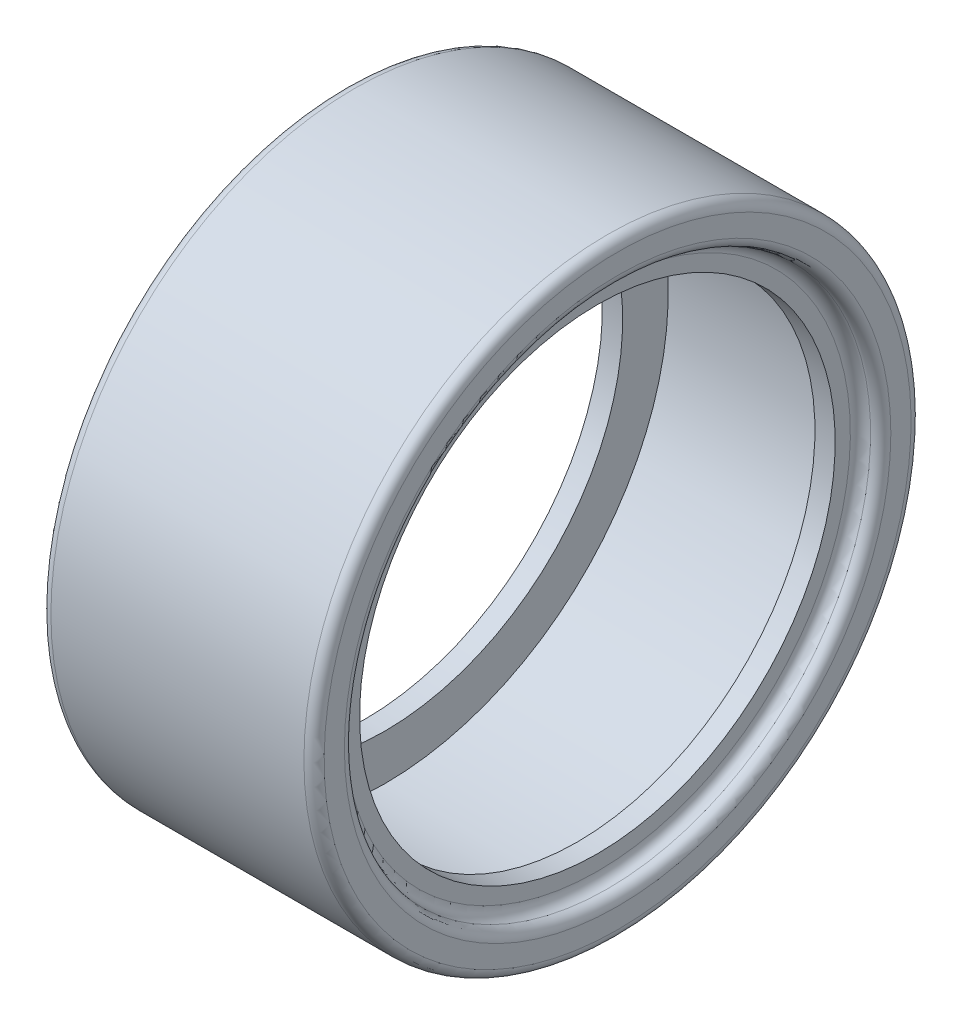
ISO-10303-21;
HEADER;
FILE_DESCRIPTION(('STEP AP214'),'2;1');
FILE_NAME('part.step','',(''),(''),'','','');
FILE_SCHEMA(('AUTOMOTIVE_DESIGN { 1 0 10303 214 1 1 1 1 }'));
ENDSEC;
DATA;
#1=APPLICATION_CONTEXT('core data for automotive mechanical design processes');
#2=APPLICATION_PROTOCOL_DEFINITION('international standard','automotive_design',2000,#1);
#3=PRODUCT_CONTEXT('',#1,'mechanical');
#4=PRODUCT('Part','Part','',(#3));
#5=PRODUCT_RELATED_PRODUCT_CATEGORY('part','',(#4));
#6=PRODUCT_DEFINITION_FORMATION('','',#4);
#7=PRODUCT_DEFINITION_CONTEXT('part definition',#1,'design');
#8=PRODUCT_DEFINITION('design','',#6,#7);
#9=PRODUCT_DEFINITION_SHAPE('','',#8);
#10=(LENGTH_UNIT() NAMED_UNIT(*) SI_UNIT(.MILLI.,.METRE.));
#11=(NAMED_UNIT(*) PLANE_ANGLE_UNIT() SI_UNIT($,.RADIAN.));
#12=(NAMED_UNIT(*) SI_UNIT($,.STERADIAN.) SOLID_ANGLE_UNIT());
#13=UNCERTAINTY_MEASURE_WITH_UNIT(LENGTH_MEASURE(1.E-05),#10,'distance_accuracy_value','');
#14=(GEOMETRIC_REPRESENTATION_CONTEXT(3) GLOBAL_UNCERTAINTY_ASSIGNED_CONTEXT((#13)) GLOBAL_UNIT_ASSIGNED_CONTEXT((#10,
#11,#12)) REPRESENTATION_CONTEXT('',''));
#15=CARTESIAN_POINT('',(0.,0.,0.));
#16=DIRECTION('',(0.,0.,1.));
#17=DIRECTION('',(1.,0.,0.));
#18=AXIS2_PLACEMENT_3D('',#15,#16,#17);
#19=CARTESIAN_POINT('',(-11.5,0.,0.));
#20=DIRECTION('',(-1.,0.,0.));
#21=DIRECTION('',(0.,-1.,0.));
#22=AXIS2_PLACEMENT_3D('',#19,#20,#21);
#23=CYLINDRICAL_SURFACE('',#22,23.5);
#24=CARTESIAN_POINT('',(-11.5,0.,0.));
#25=DIRECTION('',(-1.,0.,0.));
#26=DIRECTION('',(0.,-1.,0.));
#27=AXIS2_PLACEMENT_3D('',#24,#25,#26);
#28=CIRCLE('',#27,23.5);
#29=CARTESIAN_POINT('',(-11.5,-23.5,0.));
#30=VERTEX_POINT('',#29);
#31=EDGE_CURVE('E196',#30,#30,#28,.T.);
#32=ORIENTED_EDGE('',*,*,#31,.T.);
#33=EDGE_LOOP('',(#32));
#34=FACE_BOUND('',#33,.T.);
#35=CARTESIAN_POINT('',(-9.49999999999999,0.,0.));
#36=DIRECTION('',(1.,0.,0.));
#37=DIRECTION('',(0.,1.,0.));
#38=AXIS2_PLACEMENT_3D('',#35,#36,#37);
#39=CIRCLE('',#38,23.5);
#40=CARTESIAN_POINT('',(-9.5,23.5,0.));
#41=VERTEX_POINT('',#40);
#42=EDGE_CURVE('E179',#41,#41,#39,.F.);
#43=ORIENTED_EDGE('',*,*,#42,.F.);
#44=EDGE_LOOP('',(#43));
#45=FACE_BOUND('',#44,.T.);
#46=ADVANCED_FACE('F41',(#34,#45),#23,.F.);
#47=CARTESIAN_POINT('',(9.5,0.,0.));
#48=DIRECTION('',(-1.,0.,0.));
#49=DIRECTION('',(0.,-1.,0.));
#50=AXIS2_PLACEMENT_3D('',#47,#48,#49);
#51=CIRCLE('',#50,23.5);
#52=CARTESIAN_POINT('',(9.50000000000001,-23.5,0.));
#53=VERTEX_POINT('',#52);
#54=EDGE_CURVE('E62',#53,#53,#51,.T.);
#55=ORIENTED_EDGE('',*,*,#54,.T.);
#56=EDGE_LOOP('',(#55));
#57=FACE_BOUND('',#56,.T.);
#58=CARTESIAN_POINT('',(11.5,0.,0.));
#59=DIRECTION('',(-1.,0.,0.));
#60=DIRECTION('',(0.,-1.,0.));
#61=AXIS2_PLACEMENT_3D('',#58,#59,#60);
#62=CIRCLE('',#61,23.5);
#63=CARTESIAN_POINT('',(11.5,-23.5,0.));
#64=VERTEX_POINT('',#63);
#65=EDGE_CURVE('E188',#64,#64,#62,.T.);
#66=ORIENTED_EDGE('',*,*,#65,.F.);
#67=EDGE_LOOP('',(#66));
#68=FACE_BOUND('',#67,.T.);
#69=ADVANCED_FACE('F92',(#57,#68),#23,.F.);
#70=CARTESIAN_POINT('',(-11.5,23.5,0.));
#71=DIRECTION('',(1.,0.,0.));
#72=DIRECTION('',(0.,1.,0.));
#73=AXIS2_PLACEMENT_3D('',#70,#71,#72);
#74=PLANE('',#73);
#75=CARTESIAN_POINT('',(-11.5,0.,0.));
#76=DIRECTION('',(1.,0.,0.));
#77=DIRECTION('',(0.,1.,0.));
#78=AXIS2_PLACEMENT_3D('',#75,#76,#77);
#79=CIRCLE('',#78,25.);
#80=CARTESIAN_POINT('',(-11.5,25.,0.));
#81=VERTEX_POINT('',#80);
#82=EDGE_CURVE('E120',#81,#81,#79,.F.);
#83=ORIENTED_EDGE('',*,*,#82,.T.);
#84=EDGE_LOOP('',(#83));
#85=FACE_BOUND('',#84,.T.);
#86=ORIENTED_EDGE('',*,*,#31,.F.);
#87=EDGE_LOOP('',(#86));
#88=FACE_BOUND('',#87,.T.);
#89=ADVANCED_FACE('F98',(#85,#88),#74,.F.);
#90=CARTESIAN_POINT('',(-13.5,26.,0.));
#91=DIRECTION('',(1.,0.,0.));
#92=DIRECTION('',(0.,1.,0.));
#93=AXIS2_PLACEMENT_3D('',#90,#91,#92);
#94=PLANE('',#93);
#95=CARTESIAN_POINT('',(-13.5,0.,0.));
#96=DIRECTION('',(1.,0.,0.));
#97=DIRECTION('',(0.,1.,0.));
#98=AXIS2_PLACEMENT_3D('',#95,#96,#97);
#99=CIRCLE('',#98,27.);
#100=CARTESIAN_POINT('',(-13.5,27.,0.));
#101=VERTEX_POINT('',#100);
#102=EDGE_CURVE('E56',#101,#101,#99,.T.);
#103=ORIENTED_EDGE('',*,*,#102,.T.);
#104=EDGE_LOOP('',(#103));
#105=FACE_BOUND('',#104,.T.);
#106=CARTESIAN_POINT('',(-13.5,0.,0.));
#107=DIRECTION('',(1.,0.,0.));
#108=DIRECTION('',(0.,1.,0.));
#109=AXIS2_PLACEMENT_3D('',#106,#107,#108);
#110=CIRCLE('',#109,29.);
#111=CARTESIAN_POINT('',(-13.5,29.,0.));
#112=VERTEX_POINT('',#111);
#113=EDGE_CURVE('E126',#112,#112,#110,.F.);
#114=ORIENTED_EDGE('',*,*,#113,.T.);
#115=EDGE_LOOP('',(#114));
#116=FACE_BOUND('',#115,.T.);
#117=ADVANCED_FACE('F138',(#105,#116),#94,.F.);
#118=CARTESIAN_POINT('',(-11.5,0.,0.));
#119=DIRECTION('',(-1.,0.,0.));
#120=DIRECTION('',(0.,-1.,0.));
#121=AXIS2_PLACEMENT_3D('',#118,#119,#120);
#122=CYLINDRICAL_SURFACE('',#121,30.);
#123=CARTESIAN_POINT('',(-12.5,0.,0.));
#124=DIRECTION('',(1.,0.,0.));
#125=DIRECTION('',(0.,1.,0.));
#126=AXIS2_PLACEMENT_3D('',#123,#124,#125);
#127=CIRCLE('',#126,30.);
#128=CARTESIAN_POINT('',(-12.5,30.,0.));
#129=VERTEX_POINT('',#128);
#130=EDGE_CURVE('E10',#129,#129,#127,.T.);
#131=ORIENTED_EDGE('',*,*,#130,.T.);
#132=EDGE_LOOP('',(#131));
#133=FACE_BOUND('',#132,.T.);
#134=CARTESIAN_POINT('',(12.5,0.,0.));
#135=DIRECTION('',(-1.,0.,0.));
#136=DIRECTION('',(0.,-1.,0.));
#137=AXIS2_PLACEMENT_3D('',#134,#135,#136);
#138=CIRCLE('',#137,30.);
#139=CARTESIAN_POINT('',(12.5,-30.,0.));
#140=VERTEX_POINT('',#139);
#141=EDGE_CURVE('E50',#140,#140,#138,.T.);
#142=ORIENTED_EDGE('',*,*,#141,.T.);
#143=EDGE_LOOP('',(#142));
#144=FACE_BOUND('',#143,.T.);
#145=ADVANCED_FACE('F141',(#133,#144),#122,.T.);
#146=CARTESIAN_POINT('',(13.5,30.,0.));
#147=DIRECTION('',(-1.,0.,0.));
#148=DIRECTION('',(0.,-1.,0.));
#149=AXIS2_PLACEMENT_3D('',#146,#147,#148);
#150=PLANE('',#149);
#151=CARTESIAN_POINT('',(13.5,0.,0.));
#152=DIRECTION('',(-1.,0.,0.));
#153=DIRECTION('',(0.,-1.,0.));
#154=AXIS2_PLACEMENT_3D('',#151,#152,#153);
#155=CIRCLE('',#154,27.);
#156=CARTESIAN_POINT('',(13.5,-27.,0.));
#157=VERTEX_POINT('',#156);
#158=EDGE_CURVE('E117',#157,#157,#155,.T.);
#159=ORIENTED_EDGE('',*,*,#158,.T.);
#160=EDGE_LOOP('',(#159));
#161=FACE_BOUND('',#160,.T.);
#162=CARTESIAN_POINT('',(13.5,0.,0.));
#163=DIRECTION('',(-1.,0.,0.));
#164=DIRECTION('',(0.,-1.,0.));
#165=AXIS2_PLACEMENT_3D('',#162,#163,#164);
#166=CIRCLE('',#165,29.);
#167=CARTESIAN_POINT('',(13.5,-29.,0.));
#168=VERTEX_POINT('',#167);
#169=EDGE_CURVE('E121',#168,#168,#166,.F.);
#170=ORIENTED_EDGE('',*,*,#169,.T.);
#171=EDGE_LOOP('',(#170));
#172=FACE_BOUND('',#171,.T.);
#173=ADVANCED_FACE('F157',(#161,#172),#150,.F.);
#174=CARTESIAN_POINT('',(11.5,26.,0.));
#175=DIRECTION('',(-1.,0.,0.));
#176=DIRECTION('',(0.,-1.,0.));
#177=AXIS2_PLACEMENT_3D('',#174,#175,#176);
#178=PLANE('',#177);
#179=CARTESIAN_POINT('',(11.5,0.,0.));
#180=DIRECTION('',(-1.,0.,0.));
#181=DIRECTION('',(0.,-1.,0.));
#182=AXIS2_PLACEMENT_3D('',#179,#180,#181);
#183=CIRCLE('',#182,25.);
#184=CARTESIAN_POINT('',(11.5,-25.,0.));
#185=VERTEX_POINT('',#184);
#186=EDGE_CURVE('E129',#185,#185,#183,.F.);
#187=ORIENTED_EDGE('',*,*,#186,.T.);
#188=EDGE_LOOP('',(#187));
#189=FACE_BOUND('',#188,.T.);
#190=ORIENTED_EDGE('',*,*,#65,.T.);
#191=EDGE_LOOP('',(#190));
#192=FACE_BOUND('',#191,.T.);
#193=ADVANCED_FACE('F162',(#189,#192),#178,.F.);
#194=CARTESIAN_POINT('',(-9.5,23.5,0.));
#195=DIRECTION('',(1.,0.,0.));
#196=DIRECTION('',(0.,1.,0.));
#197=AXIS2_PLACEMENT_3D('',#194,#195,#196);
#198=PLANE('',#197);
#199=ORIENTED_EDGE('',*,*,#42,.T.);
#200=EDGE_LOOP('',(#199));
#201=FACE_BOUND('',#200,.T.);
#202=CARTESIAN_POINT('',(-9.49999999999999,0.,0.));
#203=DIRECTION('',(1.,0.,0.));
#204=DIRECTION('',(0.,1.,0.));
#205=AXIS2_PLACEMENT_3D('',#202,#203,#204);
#206=CIRCLE('',#205,28.);
#207=CARTESIAN_POINT('',(-9.5,28.,0.));
#208=VERTEX_POINT('',#207);
#209=EDGE_CURVE('E182',#208,#208,#206,.F.);
#210=ORIENTED_EDGE('',*,*,#209,.F.);
#211=EDGE_LOOP('',(#210));
#212=FACE_BOUND('',#211,.T.);
#213=ADVANCED_FACE('F166',(#201,#212),#198,.T.);
#214=CARTESIAN_POINT('',(-11.5,0.,0.));
#215=DIRECTION('',(-1.,0.,0.));
#216=DIRECTION('',(0.,-1.,0.));
#217=AXIS2_PLACEMENT_3D('',#214,#215,#216);
#218=CYLINDRICAL_SURFACE('',#217,28.);
#219=CARTESIAN_POINT('',(9.5,0.,0.));
#220=DIRECTION('',(-1.,0.,0.));
#221=DIRECTION('',(0.,-1.,0.));
#222=AXIS2_PLACEMENT_3D('',#219,#220,#221);
#223=CIRCLE('',#222,28.);
#224=CARTESIAN_POINT('',(9.50000000000001,-28.,0.));
#225=VERTEX_POINT('',#224);
#226=EDGE_CURVE('E68',#225,#225,#223,.T.);
#227=ORIENTED_EDGE('',*,*,#226,.F.);
#228=EDGE_LOOP('',(#227));
#229=FACE_BOUND('',#228,.T.);
#230=ORIENTED_EDGE('',*,*,#209,.T.);
#231=EDGE_LOOP('',(#230));
#232=FACE_BOUND('',#231,.T.);
#233=ADVANCED_FACE('F111',(#229,#232),#218,.F.);
#234=CARTESIAN_POINT('',(9.5,26.,0.));
#235=DIRECTION('',(-1.,0.,0.));
#236=DIRECTION('',(0.,-1.,0.));
#237=AXIS2_PLACEMENT_3D('',#234,#235,#236);
#238=PLANE('',#237);
#239=ORIENTED_EDGE('',*,*,#226,.T.);
#240=EDGE_LOOP('',(#239));
#241=FACE_BOUND('',#240,.T.);
#242=ORIENTED_EDGE('',*,*,#54,.F.);
#243=EDGE_LOOP('',(#242));
#244=FACE_BOUND('',#243,.T.);
#245=ADVANCED_FACE('F106',(#241,#244),#238,.T.);
#246=CARTESIAN_POINT('',(12.5,0.,0.));
#247=DIRECTION('',(-1.,0.,0.));
#248=DIRECTION('',(0.,-1.,0.));
#249=AXIS2_PLACEMENT_3D('',#246,#247,#248);
#250=TOROIDAL_SURFACE('',#249,27.,1.);
#251=ORIENTED_EDGE('',*,*,#158,.F.);
#252=EDGE_LOOP('',(#251));
#253=FACE_BOUND('',#252,.T.);
#254=CARTESIAN_POINT('',(12.5,0.,0.));
#255=DIRECTION('',(-1.,0.,0.));
#256=DIRECTION('',(0.,-1.,0.));
#257=AXIS2_PLACEMENT_3D('',#254,#255,#256);
#258=CIRCLE('',#257,26.);
#259=CARTESIAN_POINT('',(12.5,-26.,0.));
#260=VERTEX_POINT('',#259);
#261=EDGE_CURVE('E59',#260,#260,#258,.F.);
#262=ORIENTED_EDGE('',*,*,#261,.F.);
#263=EDGE_LOOP('',(#262));
#264=FACE_BOUND('',#263,.T.);
#265=ADVANCED_FACE('F87',(#253,#264),#250,.T.);
#266=CARTESIAN_POINT('',(12.5,0.,0.));
#267=DIRECTION('',(-1.,0.,0.));
#268=DIRECTION('',(0.,-1.,0.));
#269=AXIS2_PLACEMENT_3D('',#266,#267,#268);
#270=TOROIDAL_SURFACE('',#269,25.,1.);
#271=ORIENTED_EDGE('',*,*,#186,.F.);
#272=EDGE_LOOP('',(#271));
#273=FACE_BOUND('',#272,.T.);
#274=ORIENTED_EDGE('',*,*,#261,.T.);
#275=EDGE_LOOP('',(#274));
#276=FACE_BOUND('',#275,.T.);
#277=ADVANCED_FACE('F78',(#273,#276),#270,.F.);
#278=CARTESIAN_POINT('',(-12.5,0.,0.));
#279=DIRECTION('',(1.,0.,0.));
#280=DIRECTION('',(0.,1.,0.));
#281=AXIS2_PLACEMENT_3D('',#278,#279,#280);
#282=TOROIDAL_SURFACE('',#281,27.,1.);
#283=ORIENTED_EDGE('',*,*,#102,.F.);
#284=EDGE_LOOP('',(#283));
#285=FACE_BOUND('',#284,.T.);
#286=CARTESIAN_POINT('',(-12.5,0.,0.));
#287=DIRECTION('',(1.,0.,0.));
#288=DIRECTION('',(0.,1.,0.));
#289=AXIS2_PLACEMENT_3D('',#286,#287,#288);
#290=CIRCLE('',#289,26.);
#291=CARTESIAN_POINT('',(-12.5,26.,0.));
#292=VERTEX_POINT('',#291);
#293=EDGE_CURVE('E45',#292,#292,#290,.F.);
#294=ORIENTED_EDGE('',*,*,#293,.F.);
#295=EDGE_LOOP('',(#294));
#296=FACE_BOUND('',#295,.T.);
#297=ADVANCED_FACE('F76',(#285,#296),#282,.T.);
#298=CARTESIAN_POINT('',(-12.5,0.,0.));
#299=DIRECTION('',(1.,0.,0.));
#300=DIRECTION('',(0.,1.,0.));
#301=AXIS2_PLACEMENT_3D('',#298,#299,#300);
#302=TOROIDAL_SURFACE('',#301,25.,1.);
#303=ORIENTED_EDGE('',*,*,#293,.T.);
#304=EDGE_LOOP('',(#303));
#305=FACE_BOUND('',#304,.T.);
#306=ORIENTED_EDGE('',*,*,#82,.F.);
#307=EDGE_LOOP('',(#306));
#308=FACE_BOUND('',#307,.T.);
#309=ADVANCED_FACE('F73',(#305,#308),#302,.F.);
#310=CARTESIAN_POINT('',(-12.5,0.,0.));
#311=DIRECTION('',(1.,0.,0.));
#312=DIRECTION('',(0.,1.,0.));
#313=AXIS2_PLACEMENT_3D('',#310,#311,#312);
#314=TOROIDAL_SURFACE('',#313,29.,1.);
#315=ORIENTED_EDGE('',*,*,#130,.F.);
#316=EDGE_LOOP('',(#315));
#317=FACE_BOUND('',#316,.T.);
#318=ORIENTED_EDGE('',*,*,#113,.F.);
#319=EDGE_LOOP('',(#318));
#320=FACE_BOUND('',#319,.T.);
#321=ADVANCED_FACE('F85',(#317,#320),#314,.T.);
#322=CARTESIAN_POINT('',(12.5,0.,0.));
#323=DIRECTION('',(-1.,0.,0.));
#324=DIRECTION('',(0.,-1.,0.));
#325=AXIS2_PLACEMENT_3D('',#322,#323,#324);
#326=TOROIDAL_SURFACE('',#325,29.,1.);
#327=ORIENTED_EDGE('',*,*,#169,.F.);
#328=EDGE_LOOP('',(#327));
#329=FACE_BOUND('',#328,.T.);
#330=ORIENTED_EDGE('',*,*,#141,.F.);
#331=EDGE_LOOP('',(#330));
#332=FACE_BOUND('',#331,.T.);
#333=ADVANCED_FACE('F43',(#329,#332),#326,.T.);
#334=CLOSED_SHELL('',(#46,#69,#89,#117,#145,#173,#193,#213,#233,#245,#265,#277,#297,#309,#321,#333));
#335=MANIFOLD_SOLID_BREP('B2',#334);
#336=ADVANCED_BREP_SHAPE_REPRESENTATION('',(#18,#335),#14);
#337=SHAPE_DEFINITION_REPRESENTATION(#9,#336);
ENDSEC;
END-ISO-10303-21;
